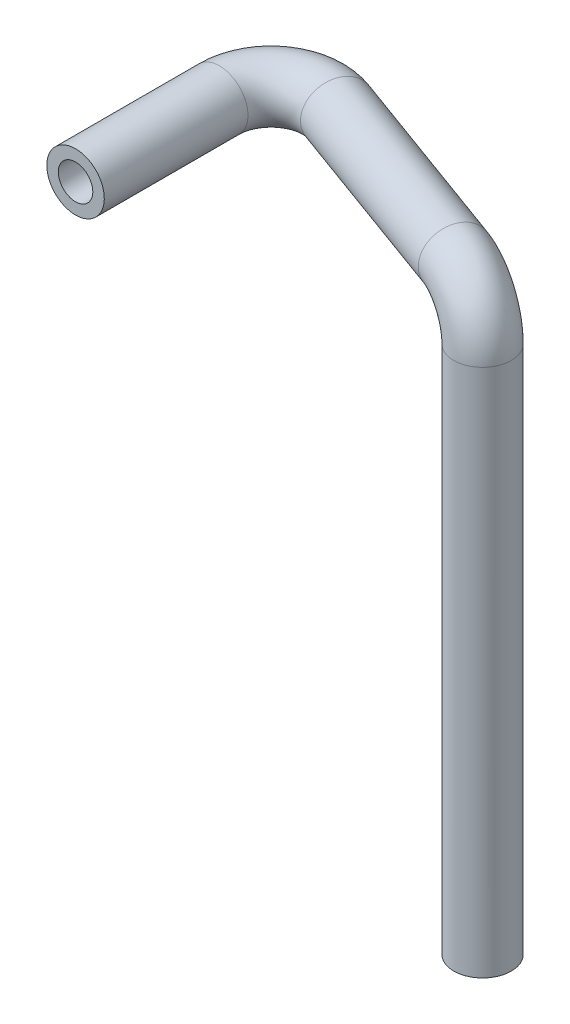
ISO-10303-21;
HEADER;
FILE_DESCRIPTION(('STEP AP214'),'2;1');
FILE_NAME('part.step','',(''),(''),'','','');
FILE_SCHEMA(('AUTOMOTIVE_DESIGN { 1 0 10303 214 1 1 1 1 }'));
ENDSEC;
DATA;
#1=APPLICATION_CONTEXT('core data for automotive mechanical design processes');
#2=APPLICATION_PROTOCOL_DEFINITION('international standard','automotive_design',2000,#1);
#3=PRODUCT_CONTEXT('',#1,'mechanical');
#4=PRODUCT('Part','Part','',(#3));
#5=PRODUCT_RELATED_PRODUCT_CATEGORY('part','',(#4));
#6=PRODUCT_DEFINITION_FORMATION('','',#4);
#7=PRODUCT_DEFINITION_CONTEXT('part definition',#1,'design');
#8=PRODUCT_DEFINITION('design','',#6,#7);
#9=PRODUCT_DEFINITION_SHAPE('','',#8);
#10=(LENGTH_UNIT() NAMED_UNIT(*) SI_UNIT(.MILLI.,.METRE.));
#11=(NAMED_UNIT(*) PLANE_ANGLE_UNIT() SI_UNIT($,.RADIAN.));
#12=(NAMED_UNIT(*) SI_UNIT($,.STERADIAN.) SOLID_ANGLE_UNIT());
#13=UNCERTAINTY_MEASURE_WITH_UNIT(LENGTH_MEASURE(1.E-05),#10,'distance_accuracy_value','');
#14=(GEOMETRIC_REPRESENTATION_CONTEXT(3) GLOBAL_UNCERTAINTY_ASSIGNED_CONTEXT((#13)) GLOBAL_UNIT_ASSIGNED_CONTEXT((#10,
#11,#12)) REPRESENTATION_CONTEXT('',''));
#15=CARTESIAN_POINT('',(0.,0.,0.));
#16=DIRECTION('',(0.,0.,1.));
#17=DIRECTION('',(1.,0.,0.));
#18=AXIS2_PLACEMENT_3D('',#15,#16,#17);
#19=CARTESIAN_POINT('',(-5.,0.,0.));
#20=DIRECTION('',(0.,0.,-1.));
#21=DIRECTION('',(0.,1.,0.));
#22=AXIS2_PLACEMENT_3D('',#19,#20,#21);
#23=CYLINDRICAL_SURFACE('',#22,3.);
#24=CARTESIAN_POINT('',(-5.,0.,0.));
#25=DIRECTION('',(0.,0.,-1.));
#26=DIRECTION('',(0.,1.,0.));
#27=AXIS2_PLACEMENT_3D('',#24,#25,#26);
#28=CIRCLE('',#27,3.);
#29=CARTESIAN_POINT('',(-5.,3.,0.));
#30=VERTEX_POINT('',#29);
#31=EDGE_CURVE('E18',#30,#30,#28,.T.);
#32=ORIENTED_EDGE('',*,*,#31,.F.);
#33=EDGE_LOOP('',(#32));
#34=FACE_BOUND('',#33,.T.);
#35=CARTESIAN_POINT('',(-5.,0.,-25.));
#36=DIRECTION('',(0.,0.,-1.));
#37=DIRECTION('',(-1.,0.,0.));
#38=AXIS2_PLACEMENT_3D('',#35,#36,#37);
#39=CIRCLE('',#38,3.);
#40=CARTESIAN_POINT('',(-8.,0.,-25.));
#41=VERTEX_POINT('',#40);
#42=EDGE_CURVE('E31',#41,#41,#39,.T.);
#43=ORIENTED_EDGE('',*,*,#42,.T.);
#44=EDGE_LOOP('',(#43));
#45=FACE_BOUND('',#44,.T.);
#46=ADVANCED_FACE('F15',(#34,#45),#23,.F.);
#47=CARTESIAN_POINT('',(0.,0.,0.));
#48=DIRECTION('',(0.,0.,1.));
#49=DIRECTION('',(1.,0.,0.));
#50=AXIS2_PLACEMENT_3D('',#47,#48,#49);
#51=PLANE('',#50);
#52=ORIENTED_EDGE('',*,*,#31,.T.);
#53=EDGE_LOOP('',(#52));
#54=FACE_BOUND('',#53,.T.);
#55=CARTESIAN_POINT('',(-5.,0.,0.));
#56=DIRECTION('',(0.,0.,-1.));
#57=DIRECTION('',(0.,1.,0.));
#58=AXIS2_PLACEMENT_3D('',#55,#56,#57);
#59=CIRCLE('',#58,5.);
#60=CARTESIAN_POINT('',(-5.,5.,0.));
#61=VERTEX_POINT('',#60);
#62=EDGE_CURVE('E36',#61,#61,#59,.T.);
#63=ORIENTED_EDGE('',*,*,#62,.F.);
#64=EDGE_LOOP('',(#63));
#65=FACE_BOUND('',#64,.T.);
#66=ADVANCED_FACE('F61',(#54,#65),#51,.T.);
#67=CARTESIAN_POINT('',(4.,0.,-25.));
#68=DIRECTION('',(0.,-1.,0.));
#69=DIRECTION('',(0.,0.,-1.));
#70=AXIS2_PLACEMENT_3D('',#67,#68,#69);
#71=TOROIDAL_SURFACE('',#70,9.,3.);
#72=ORIENTED_EDGE('',*,*,#42,.F.);
#73=EDGE_LOOP('',(#72));
#74=FACE_BOUND('',#73,.T.);
#75=CARTESIAN_POINT('',(7.07818128993105,0.,-33.4572335870732));
#76=DIRECTION('',(0.939692620785907,0.,0.342020143325673));
#77=DIRECTION('',(0.342020143325673,0.,-0.939692620785907));
#78=AXIS2_PLACEMENT_3D('',#75,#76,#77);
#79=CIRCLE('',#78,3.);
#80=CARTESIAN_POINT('',(8.10424171990807,0.,-36.2763114494309));
#81=VERTEX_POINT('',#80);
#82=EDGE_CURVE('E39',#81,#81,#79,.T.);
#83=ORIENTED_EDGE('',*,*,#82,.T.);
#84=EDGE_LOOP('',(#83));
#85=FACE_BOUND('',#84,.T.);
#86=ADVANCED_FACE('F57',(#74,#85),#71,.F.);
#87=CARTESIAN_POINT('',(-5.,0.,0.));
#88=DIRECTION('',(0.,0.,-1.));
#89=DIRECTION('',(0.,1.,0.));
#90=AXIS2_PLACEMENT_3D('',#87,#88,#89);
#91=CYLINDRICAL_SURFACE('',#90,5.);
#92=CARTESIAN_POINT('',(-5.,0.,-25.));
#93=DIRECTION('',(0.,0.,-1.));
#94=DIRECTION('',(-1.,0.,0.));
#95=AXIS2_PLACEMENT_3D('',#92,#93,#94);
#96=CIRCLE('',#95,5.);
#97=CARTESIAN_POINT('',(-10.,0.,-25.));
#98=VERTEX_POINT('',#97);
#99=EDGE_CURVE('E46',#98,#98,#96,.T.);
#100=ORIENTED_EDGE('',*,*,#99,.F.);
#101=EDGE_LOOP('',(#100));
#102=FACE_BOUND('',#101,.T.);
#103=ORIENTED_EDGE('',*,*,#62,.T.);
#104=EDGE_LOOP('',(#103));
#105=FACE_BOUND('',#104,.T.);
#106=ADVANCED_FACE('F60',(#102,#105),#91,.T.);
#107=CARTESIAN_POINT('',(7.07818128993106,0.,-33.4572335870732));
#108=DIRECTION('',(0.939692620785907,0.,0.342020143325673));
#109=DIRECTION('',(0.342020143325673,0.,-0.939692620785907));
#110=AXIS2_PLACEMENT_3D('',#107,#108,#109);
#111=CYLINDRICAL_SURFACE('',#110,3.);
#112=ORIENTED_EDGE('',*,*,#82,.F.);
#113=EDGE_LOOP('',(#112));
#114=FACE_BOUND('',#113,.T.);
#115=CARTESIAN_POINT('',(39.2978055480647,0.,-21.7302493978711));
#116=DIRECTION('',(0.939692620785907,0.,0.342020143325673));
#117=DIRECTION('',(0.,1.,0.));
#118=AXIS2_PLACEMENT_3D('',#115,#116,#117);
#119=CIRCLE('',#118,3.);
#120=CARTESIAN_POINT('',(39.2978055480647,3.00000000000004,-21.7302493978711));
#121=VERTEX_POINT('',#120);
#122=EDGE_CURVE('E72',#121,#121,#119,.T.);
#123=ORIENTED_EDGE('',*,*,#122,.T.);
#124=EDGE_LOOP('',(#123));
#125=FACE_BOUND('',#124,.T.);
#126=ADVANCED_FACE('F65',(#114,#125),#111,.F.);
#127=CARTESIAN_POINT('',(39.2978055480646,-7.99999999999997,-21.7302493978711));
#128=DIRECTION('',(0.342020143325673,0.,-0.939692620785907));
#129=DIRECTION('',(-0.939692620785907,0.,-0.342020143325673));
#130=AXIS2_PLACEMENT_3D('',#127,#128,#129);
#131=TOROIDAL_SURFACE('',#130,8.00000000000001,3.);
#132=ORIENTED_EDGE('',*,*,#122,.F.);
#133=EDGE_LOOP('',(#132));
#134=FACE_BOUND('',#133,.T.);
#135=CARTESIAN_POINT('',(46.8153465143519,-7.99999999999996,-18.9940882512657));
#136=DIRECTION('',(0.,-1.,0.));
#137=DIRECTION('',(1.,0.,0.));
#138=AXIS2_PLACEMENT_3D('',#135,#136,#137);
#139=CIRCLE('',#138,3.);
#140=CARTESIAN_POINT('',(49.8153465143519,-7.99999999999996,-18.9940882512657));
#141=VERTEX_POINT('',#140);
#142=EDGE_CURVE('E74',#141,#141,#139,.T.);
#143=ORIENTED_EDGE('',*,*,#142,.T.);
#144=EDGE_LOOP('',(#143));
#145=FACE_BOUND('',#144,.T.);
#146=ADVANCED_FACE('F68',(#134,#145),#131,.F.);
#147=CARTESIAN_POINT('',(4.,0.,-25.));
#148=DIRECTION('',(0.,-1.,0.));
#149=DIRECTION('',(0.,0.,-1.));
#150=AXIS2_PLACEMENT_3D('',#147,#148,#149);
#151=TOROIDAL_SURFACE('',#150,9.,5.);
#152=ORIENTED_EDGE('',*,*,#99,.T.);
#153=EDGE_LOOP('',(#152));
#154=FACE_BOUND('',#153,.T.);
#155=CARTESIAN_POINT('',(7.07818128993105,0.,-33.4572335870732));
#156=DIRECTION('',(0.939692620785907,0.,0.342020143325673));
#157=DIRECTION('',(0.342020143325673,0.,-0.939692620785907));
#158=AXIS2_PLACEMENT_3D('',#155,#156,#157);
#159=CIRCLE('',#158,5.);
#160=CARTESIAN_POINT('',(8.78828200655942,0.,-38.1556966910027));
#161=VERTEX_POINT('',#160);
#162=EDGE_CURVE('E35',#161,#161,#159,.T.);
#163=ORIENTED_EDGE('',*,*,#162,.F.);
#164=EDGE_LOOP('',(#163));
#165=FACE_BOUND('',#164,.T.);
#166=ADVANCED_FACE('F113',(#154,#165),#151,.T.);
#167=CARTESIAN_POINT('',(46.8153465143519,-7.99999999999996,-18.9940882512657));
#168=DIRECTION('',(0.,-1.,0.));
#169=DIRECTION('',(1.,0.,0.));
#170=AXIS2_PLACEMENT_3D('',#167,#168,#169);
#171=CYLINDRICAL_SURFACE('',#170,3.);
#172=CARTESIAN_POINT('',(46.8153465143519,-100.,-18.9940882512657));
#173=DIRECTION('',(0.,-1.,0.));
#174=DIRECTION('',(1.,0.,0.));
#175=AXIS2_PLACEMENT_3D('',#172,#173,#174);
#176=CIRCLE('',#175,3.);
#177=CARTESIAN_POINT('',(49.8153465143519,-100.,-18.9940882512657));
#178=VERTEX_POINT('',#177);
#179=EDGE_CURVE('E33',#178,#178,#176,.T.);
#180=ORIENTED_EDGE('',*,*,#179,.T.);
#181=EDGE_LOOP('',(#180));
#182=FACE_BOUND('',#181,.T.);
#183=ORIENTED_EDGE('',*,*,#142,.F.);
#184=EDGE_LOOP('',(#183));
#185=FACE_BOUND('',#184,.T.);
#186=ADVANCED_FACE('F117',(#182,#185),#171,.F.);
#187=CARTESIAN_POINT('',(7.07818128993106,0.,-33.4572335870732));
#188=DIRECTION('',(0.939692620785907,0.,0.342020143325673));
#189=DIRECTION('',(0.342020143325673,0.,-0.939692620785907));
#190=AXIS2_PLACEMENT_3D('',#187,#188,#189);
#191=CYLINDRICAL_SURFACE('',#190,5.);
#192=ORIENTED_EDGE('',*,*,#162,.T.);
#193=EDGE_LOOP('',(#192));
#194=FACE_BOUND('',#193,.T.);
#195=CARTESIAN_POINT('',(39.2978055480647,0.,-21.7302493978711));
#196=DIRECTION('',(0.939692620785907,0.,0.342020143325673));
#197=DIRECTION('',(0.,1.,0.));
#198=AXIS2_PLACEMENT_3D('',#195,#196,#197);
#199=CIRCLE('',#198,5.);
#200=CARTESIAN_POINT('',(39.2978055480647,5.00000000000005,-21.7302493978711));
#201=VERTEX_POINT('',#200);
#202=EDGE_CURVE('E27',#201,#201,#199,.T.);
#203=ORIENTED_EDGE('',*,*,#202,.F.);
#204=EDGE_LOOP('',(#203));
#205=FACE_BOUND('',#204,.T.);
#206=ADVANCED_FACE('F126',(#194,#205),#191,.T.);
#207=CARTESIAN_POINT('',(45.1052457977236,-100.,-14.2956251473362));
#208=DIRECTION('',(0.,1.,0.));
#209=DIRECTION('',(-1.,0.,0.));
#210=AXIS2_PLACEMENT_3D('',#207,#208,#209);
#211=PLANE('',#210);
#212=ORIENTED_EDGE('',*,*,#179,.F.);
#213=EDGE_LOOP('',(#212));
#214=FACE_BOUND('',#213,.T.);
#215=CARTESIAN_POINT('',(46.8153465143519,-100.,-18.9940882512657));
#216=DIRECTION('',(0.,-1.,0.));
#217=DIRECTION('',(1.,0.,0.));
#218=AXIS2_PLACEMENT_3D('',#215,#216,#217);
#219=CIRCLE('',#218,5.);
#220=CARTESIAN_POINT('',(51.8153465143519,-100.,-18.9940882512657));
#221=VERTEX_POINT('',#220);
#222=EDGE_CURVE('E10',#221,#221,#219,.F.);
#223=ORIENTED_EDGE('',*,*,#222,.F.);
#224=EDGE_LOOP('',(#223));
#225=FACE_BOUND('',#224,.T.);
#226=ADVANCED_FACE('F98',(#214,#225),#211,.F.);
#227=CARTESIAN_POINT('',(39.2978055480646,-7.99999999999997,-21.7302493978711));
#228=DIRECTION('',(0.342020143325673,0.,-0.939692620785907));
#229=DIRECTION('',(-0.939692620785907,0.,-0.342020143325673));
#230=AXIS2_PLACEMENT_3D('',#227,#228,#229);
#231=TOROIDAL_SURFACE('',#230,8.00000000000001,5.);
#232=CARTESIAN_POINT('',(46.8153465143519,-7.99999999999997,-18.9940882512657));
#233=DIRECTION('',(0.,-1.,0.));
#234=DIRECTION('',(1.,0.,0.));
#235=AXIS2_PLACEMENT_3D('',#232,#233,#234);
#236=CIRCLE('',#235,5.);
#237=CARTESIAN_POINT('',(51.8153465143519,-7.99999999999997,-18.9940882512657));
#238=VERTEX_POINT('',#237);
#239=EDGE_CURVE('E22',#238,#238,#236,.T.);
#240=ORIENTED_EDGE('',*,*,#239,.F.);
#241=EDGE_LOOP('',(#240));
#242=FACE_BOUND('',#241,.T.);
#243=ORIENTED_EDGE('',*,*,#202,.T.);
#244=EDGE_LOOP('',(#243));
#245=FACE_BOUND('',#244,.T.);
#246=ADVANCED_FACE('F93',(#242,#245),#231,.T.);
#247=CARTESIAN_POINT('',(46.8153465143519,-7.99999999999996,-18.9940882512657));
#248=DIRECTION('',(0.,-1.,0.));
#249=DIRECTION('',(1.,0.,0.));
#250=AXIS2_PLACEMENT_3D('',#247,#248,#249);
#251=CYLINDRICAL_SURFACE('',#250,5.);
#252=ORIENTED_EDGE('',*,*,#222,.T.);
#253=EDGE_LOOP('',(#252));
#254=FACE_BOUND('',#253,.T.);
#255=ORIENTED_EDGE('',*,*,#239,.T.);
#256=EDGE_LOOP('',(#255));
#257=FACE_BOUND('',#256,.T.);
#258=ADVANCED_FACE('F91',(#254,#257),#251,.T.);
#259=CLOSED_SHELL('',(#46,#66,#86,#106,#126,#146,#166,#186,#206,#226,#246,#258));
#260=MANIFOLD_SOLID_BREP('B1',#259);
#261=ADVANCED_BREP_SHAPE_REPRESENTATION('',(#18,#260),#14);
#262=SHAPE_DEFINITION_REPRESENTATION(#9,#261);
ENDSEC;
END-ISO-10303-21;
